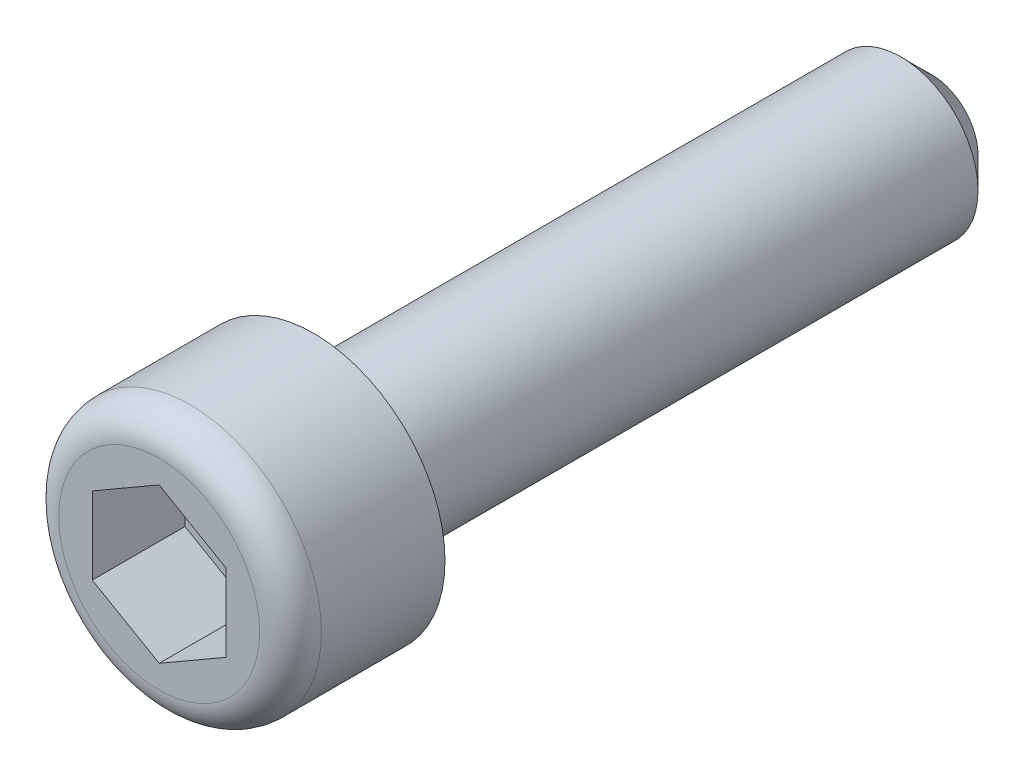
ISO-10303-21;
HEADER;
FILE_DESCRIPTION(('STEP AP214'),'2;1');
FILE_NAME('part.step','',(''),(''),'','','');
FILE_SCHEMA(('AUTOMOTIVE_DESIGN { 1 0 10303 214 1 1 1 1 }'));
ENDSEC;
DATA;
#1=APPLICATION_CONTEXT('core data for automotive mechanical design processes');
#2=APPLICATION_PROTOCOL_DEFINITION('international standard','automotive_design',2000,#1);
#3=PRODUCT_CONTEXT('',#1,'mechanical');
#4=PRODUCT('Part','Part','',(#3));
#5=PRODUCT_RELATED_PRODUCT_CATEGORY('part','',(#4));
#6=PRODUCT_DEFINITION_FORMATION('','',#4);
#7=PRODUCT_DEFINITION_CONTEXT('part definition',#1,'design');
#8=PRODUCT_DEFINITION('design','',#6,#7);
#9=PRODUCT_DEFINITION_SHAPE('','',#8);
#10=(LENGTH_UNIT() NAMED_UNIT(*) SI_UNIT(.MILLI.,.METRE.));
#11=(NAMED_UNIT(*) PLANE_ANGLE_UNIT() SI_UNIT($,.RADIAN.));
#12=(NAMED_UNIT(*) SI_UNIT($,.STERADIAN.) SOLID_ANGLE_UNIT());
#13=UNCERTAINTY_MEASURE_WITH_UNIT(LENGTH_MEASURE(1.E-05),#10,'distance_accuracy_value','');
#14=(GEOMETRIC_REPRESENTATION_CONTEXT(3) GLOBAL_UNCERTAINTY_ASSIGNED_CONTEXT((#13)) GLOBAL_UNIT_ASSIGNED_CONTEXT((#10,
#11,#12)) REPRESENTATION_CONTEXT('',''));
#15=CARTESIAN_POINT('',(0.,0.,0.));
#16=DIRECTION('',(0.,0.,1.));
#17=DIRECTION('',(1.,0.,0.));
#18=AXIS2_PLACEMENT_3D('',#15,#16,#17);
#19=CARTESIAN_POINT('',(0.,0.,0.));
#20=DIRECTION('',(0.,0.,-1.));
#21=DIRECTION('',(-1.,0.,0.));
#22=AXIS2_PLACEMENT_3D('',#19,#20,#21);
#23=PLANE('',#22);
#24=CARTESIAN_POINT('',(0.,0.,0.));
#25=DIRECTION('',(0.,0.,-1.));
#26=DIRECTION('',(-1.,0.,0.));
#27=AXIS2_PLACEMENT_3D('',#24,#25,#26);
#28=CIRCLE('',#27,3.25);
#29=CARTESIAN_POINT('',(-3.25,0.,0.));
#30=VERTEX_POINT('',#29);
#31=EDGE_CURVE('E43',#30,#30,#28,.F.);
#32=ORIENTED_EDGE('',*,*,#31,.T.);
#33=EDGE_LOOP('',(#32));
#34=FACE_BOUND('',#33,.T.);
#35=DIRECTION('',(-0.866025403784439,-0.5,0.));
#36=VECTOR('',#35,1.);
#37=CARTESIAN_POINT('',(0.,2.5,0.));
#38=LINE('',#37,#36);
#39=CARTESIAN_POINT('',(0.,2.5,0.));
#40=VERTEX_POINT('',#39);
#41=CARTESIAN_POINT('',(-2.1650635094611,1.25,0.));
#42=VERTEX_POINT('',#41);
#43=EDGE_CURVE('E124',#40,#42,#38,.T.);
#44=ORIENTED_EDGE('',*,*,#43,.F.);
#45=DIRECTION('',(-0.866025403784439,0.5,0.));
#46=VECTOR('',#45,1.);
#47=CARTESIAN_POINT('',(2.1650635094611,1.25,0.));
#48=LINE('',#47,#46);
#49=CARTESIAN_POINT('',(2.1650635094611,1.25,0.));
#50=VERTEX_POINT('',#49);
#51=EDGE_CURVE('E50',#50,#40,#48,.T.);
#52=ORIENTED_EDGE('',*,*,#51,.F.);
#53=DIRECTION('',(0.,1.,0.));
#54=VECTOR('',#53,1.);
#55=CARTESIAN_POINT('',(2.1650635094611,-1.25,0.));
#56=LINE('',#55,#54);
#57=CARTESIAN_POINT('',(2.1650635094611,-1.25,0.));
#58=VERTEX_POINT('',#57);
#59=EDGE_CURVE('E133',#58,#50,#56,.T.);
#60=ORIENTED_EDGE('',*,*,#59,.F.);
#61=DIRECTION('',(0.866025403784439,0.5,0.));
#62=VECTOR('',#61,1.);
#63=CARTESIAN_POINT('',(0.,-2.5,0.));
#64=LINE('',#63,#62);
#65=CARTESIAN_POINT('',(0.,-2.5,0.));
#66=VERTEX_POINT('',#65);
#67=EDGE_CURVE('E131',#66,#58,#64,.T.);
#68=ORIENTED_EDGE('',*,*,#67,.F.);
#69=DIRECTION('',(0.866025403784439,-0.5,0.));
#70=VECTOR('',#69,1.);
#71=CARTESIAN_POINT('',(-2.1650635094611,-1.25,0.));
#72=LINE('',#71,#70);
#73=CARTESIAN_POINT('',(-2.1650635094611,-1.25,0.));
#74=VERTEX_POINT('',#73);
#75=EDGE_CURVE('E98',#74,#66,#72,.T.);
#76=ORIENTED_EDGE('',*,*,#75,.F.);
#77=DIRECTION('',(0.,-1.,0.));
#78=VECTOR('',#77,1.);
#79=CARTESIAN_POINT('',(-2.1650635094611,1.25,0.));
#80=LINE('',#79,#78);
#81=EDGE_CURVE('E127',#42,#74,#80,.T.);
#82=ORIENTED_EDGE('',*,*,#81,.F.);
#83=EDGE_LOOP('',(#44,#52,#60,#68,#76,#82));
#84=FACE_BOUND('',#83,.T.);
#85=ADVANCED_FACE('F35',(#34,#84),#23,.F.);
#86=CARTESIAN_POINT('',(0.,0.,156.291575098795));
#87=DIRECTION('',(0.,0.,1.));
#88=DIRECTION('',(1.,0.,0.));
#89=AXIS2_PLACEMENT_3D('',#86,#87,#88);
#90=CYLINDRICAL_SURFACE('',#89,4.25);
#91=CARTESIAN_POINT('',(0.,0.,-1.));
#92=DIRECTION('',(0.,0.,-1.));
#93=DIRECTION('',(-1.,0.,0.));
#94=AXIS2_PLACEMENT_3D('',#91,#92,#93);
#95=CIRCLE('',#94,4.25);
#96=CARTESIAN_POINT('',(-4.25,0.,-1.));
#97=VERTEX_POINT('',#96);
#98=EDGE_CURVE('E11',#97,#97,#95,.T.);
#99=ORIENTED_EDGE('',*,*,#98,.T.);
#100=EDGE_LOOP('',(#99));
#101=FACE_BOUND('',#100,.T.);
#102=CARTESIAN_POINT('',(0.,0.,-5.));
#103=DIRECTION('',(0.,0.,1.));
#104=DIRECTION('',(1.,0.,0.));
#105=AXIS2_PLACEMENT_3D('',#102,#103,#104);
#106=CIRCLE('',#105,4.25);
#107=CARTESIAN_POINT('',(4.25,0.,-5.));
#108=VERTEX_POINT('',#107);
#109=EDGE_CURVE('E145',#108,#108,#106,.T.);
#110=ORIENTED_EDGE('',*,*,#109,.T.);
#111=EDGE_LOOP('',(#110));
#112=FACE_BOUND('',#111,.T.);
#113=ADVANCED_FACE('F167',(#101,#112),#90,.T.);
#114=CARTESIAN_POINT('',(0.,4.25,-5.));
#115=DIRECTION('',(0.,0.,1.));
#116=DIRECTION('',(1.,0.,0.));
#117=AXIS2_PLACEMENT_3D('',#114,#115,#116);
#118=PLANE('',#117);
#119=ORIENTED_EDGE('',*,*,#109,.F.);
#120=EDGE_LOOP('',(#119));
#121=FACE_BOUND('',#120,.T.);
#122=CARTESIAN_POINT('',(0.,0.,-5.));
#123=DIRECTION('',(0.,0.,1.));
#124=DIRECTION('',(1.,0.,0.));
#125=AXIS2_PLACEMENT_3D('',#122,#123,#124);
#126=CIRCLE('',#125,2.5);
#127=CARTESIAN_POINT('',(2.5,0.,-5.));
#128=VERTEX_POINT('',#127);
#129=EDGE_CURVE('E137',#128,#128,#126,.T.);
#130=ORIENTED_EDGE('',*,*,#129,.T.);
#131=EDGE_LOOP('',(#130));
#132=FACE_BOUND('',#131,.T.);
#133=ADVANCED_FACE('F172',(#121,#132),#118,.F.);
#134=CARTESIAN_POINT('',(0.,0.,156.291575098795));
#135=DIRECTION('',(0.,0.,1.));
#136=DIRECTION('',(1.,0.,0.));
#137=AXIS2_PLACEMENT_3D('',#134,#135,#136);
#138=CYLINDRICAL_SURFACE('',#137,2.5);
#139=CARTESIAN_POINT('',(0.,0.,-24.));
#140=DIRECTION('',(0.,0.,1.));
#141=DIRECTION('',(1.,0.,0.));
#142=AXIS2_PLACEMENT_3D('',#139,#140,#141);
#143=CIRCLE('',#142,2.5);
#144=CARTESIAN_POINT('',(2.5,0.,-24.));
#145=VERTEX_POINT('',#144);
#146=EDGE_CURVE('E148',#145,#145,#143,.T.);
#147=ORIENTED_EDGE('',*,*,#146,.T.);
#148=EDGE_LOOP('',(#147));
#149=FACE_BOUND('',#148,.T.);
#150=ORIENTED_EDGE('',*,*,#129,.F.);
#151=EDGE_LOOP('',(#150));
#152=FACE_BOUND('',#151,.T.);
#153=ADVANCED_FACE('F178',(#149,#152),#138,.T.);
#154=CARTESIAN_POINT('',(0.,2.5,-25.));
#155=DIRECTION('',(0.,0.,1.));
#156=DIRECTION('',(1.,0.,0.));
#157=AXIS2_PLACEMENT_3D('',#154,#155,#156);
#158=PLANE('',#157);
#159=CARTESIAN_POINT('',(0.,0.,-25.));
#160=DIRECTION('',(0.,0.,1.));
#161=DIRECTION('',(1.,0.,0.));
#162=AXIS2_PLACEMENT_3D('',#159,#160,#161);
#163=CIRCLE('',#162,1.49999999999998);
#164=CARTESIAN_POINT('',(1.49999999999998,0.,-25.));
#165=VERTEX_POINT('',#164);
#166=EDGE_CURVE('E151',#165,#165,#163,.F.);
#167=ORIENTED_EDGE('',*,*,#166,.T.);
#168=EDGE_LOOP('',(#167));
#169=FACE_BOUND('',#168,.T.);
#170=ADVANCED_FACE('F182',(#169),#158,.F.);
#171=CARTESIAN_POINT('',(2.1650635094611,1.25,-3.));
#172=DIRECTION('',(0.5,0.866025403784438,0.));
#173=DIRECTION('',(-0.866025403784439,0.5,0.));
#174=AXIS2_PLACEMENT_3D('',#171,#172,#173);
#175=PLANE('',#174);
#176=ORIENTED_EDGE('',*,*,#51,.T.);
#177=DIRECTION('',(0.,0.,1.));
#178=VECTOR('',#177,1.);
#179=CARTESIAN_POINT('',(0.,2.5,-3.));
#180=LINE('',#179,#178);
#181=CARTESIAN_POINT('',(0.,2.5,-3.));
#182=VERTEX_POINT('',#181);
#183=EDGE_CURVE('E80',#182,#40,#180,.T.);
#184=ORIENTED_EDGE('',*,*,#183,.F.);
#185=DIRECTION('',(-0.866025403784439,0.5,0.));
#186=VECTOR('',#185,1.);
#187=CARTESIAN_POINT('',(2.1650635094611,1.25,-3.));
#188=LINE('',#187,#186);
#189=CARTESIAN_POINT('',(2.1650635094611,1.25,-3.));
#190=VERTEX_POINT('',#189);
#191=EDGE_CURVE('E135',#190,#182,#188,.T.);
#192=ORIENTED_EDGE('',*,*,#191,.F.);
#193=DIRECTION('',(0.,0.,1.));
#194=VECTOR('',#193,1.);
#195=CARTESIAN_POINT('',(2.1650635094611,1.25,-3.));
#196=LINE('',#195,#194);
#197=EDGE_CURVE('E58',#190,#50,#196,.T.);
#198=ORIENTED_EDGE('',*,*,#197,.T.);
#199=EDGE_LOOP('',(#176,#184,#192,#198));
#200=FACE_BOUND('',#199,.T.);
#201=ADVANCED_FACE('F186',(#200),#175,.F.);
#202=CARTESIAN_POINT('',(2.1650635094611,-1.25,-3.));
#203=DIRECTION('',(1.,0.,0.));
#204=DIRECTION('',(0.,0.,-1.));
#205=AXIS2_PLACEMENT_3D('',#202,#203,#204);
#206=PLANE('',#205);
#207=ORIENTED_EDGE('',*,*,#59,.T.);
#208=ORIENTED_EDGE('',*,*,#197,.F.);
#209=DIRECTION('',(0.,1.,0.));
#210=VECTOR('',#209,1.);
#211=CARTESIAN_POINT('',(2.1650635094611,-1.25,-3.));
#212=LINE('',#211,#210);
#213=CARTESIAN_POINT('',(2.1650635094611,-1.25,-3.));
#214=VERTEX_POINT('',#213);
#215=EDGE_CURVE('E110',#214,#190,#212,.T.);
#216=ORIENTED_EDGE('',*,*,#215,.F.);
#217=DIRECTION('',(0.,0.,1.));
#218=VECTOR('',#217,1.);
#219=CARTESIAN_POINT('',(2.1650635094611,-1.25,-3.));
#220=LINE('',#219,#218);
#221=EDGE_CURVE('E102',#214,#58,#220,.T.);
#222=ORIENTED_EDGE('',*,*,#221,.T.);
#223=EDGE_LOOP('',(#207,#208,#216,#222));
#224=FACE_BOUND('',#223,.T.);
#225=ADVANCED_FACE('F190',(#224),#206,.F.);
#226=CARTESIAN_POINT('',(0.,-2.5,-3.));
#227=DIRECTION('',(0.5,-0.866025403784439,0.));
#228=DIRECTION('',(0.866025403784439,0.5,0.));
#229=AXIS2_PLACEMENT_3D('',#226,#227,#228);
#230=PLANE('',#229);
#231=ORIENTED_EDGE('',*,*,#67,.T.);
#232=ORIENTED_EDGE('',*,*,#221,.F.);
#233=DIRECTION('',(0.866025403784439,0.5,0.));
#234=VECTOR('',#233,1.);
#235=CARTESIAN_POINT('',(0.,-2.5,-3.));
#236=LINE('',#235,#234);
#237=CARTESIAN_POINT('',(0.,-2.5,-3.));
#238=VERTEX_POINT('',#237);
#239=EDGE_CURVE('E106',#238,#214,#236,.T.);
#240=ORIENTED_EDGE('',*,*,#239,.F.);
#241=DIRECTION('',(0.,0.,1.));
#242=VECTOR('',#241,1.);
#243=CARTESIAN_POINT('',(0.,-2.5,-3.));
#244=LINE('',#243,#242);
#245=EDGE_CURVE('E91',#238,#66,#244,.T.);
#246=ORIENTED_EDGE('',*,*,#245,.T.);
#247=EDGE_LOOP('',(#231,#232,#240,#246));
#248=FACE_BOUND('',#247,.T.);
#249=ADVANCED_FACE('F107',(#248),#230,.F.);
#250=CARTESIAN_POINT('',(-2.1650635094611,-1.25,-3.));
#251=DIRECTION('',(-0.5,-0.866025403784438,0.));
#252=DIRECTION('',(0.866025403784439,-0.5,0.));
#253=AXIS2_PLACEMENT_3D('',#250,#251,#252);
#254=PLANE('',#253);
#255=ORIENTED_EDGE('',*,*,#75,.T.);
#256=ORIENTED_EDGE('',*,*,#245,.F.);
#257=DIRECTION('',(0.866025403784439,-0.5,0.));
#258=VECTOR('',#257,1.);
#259=CARTESIAN_POINT('',(-2.1650635094611,-1.25,-3.));
#260=LINE('',#259,#258);
#261=CARTESIAN_POINT('',(-2.1650635094611,-1.25,-3.));
#262=VERTEX_POINT('',#261);
#263=EDGE_CURVE('E95',#262,#238,#260,.T.);
#264=ORIENTED_EDGE('',*,*,#263,.F.);
#265=DIRECTION('',(0.,0.,1.));
#266=VECTOR('',#265,1.);
#267=CARTESIAN_POINT('',(-2.1650635094611,-1.25,-3.));
#268=LINE('',#267,#266);
#269=EDGE_CURVE('E103',#262,#74,#268,.T.);
#270=ORIENTED_EDGE('',*,*,#269,.T.);
#271=EDGE_LOOP('',(#255,#256,#264,#270));
#272=FACE_BOUND('',#271,.T.);
#273=ADVANCED_FACE('F93',(#272),#254,.F.);
#274=CARTESIAN_POINT('',(-2.1650635094611,1.25,-3.));
#275=DIRECTION('',(-1.,0.,0.));
#276=DIRECTION('',(0.,-1.,0.));
#277=AXIS2_PLACEMENT_3D('',#274,#275,#276);
#278=PLANE('',#277);
#279=ORIENTED_EDGE('',*,*,#81,.T.);
#280=ORIENTED_EDGE('',*,*,#269,.F.);
#281=DIRECTION('',(0.,-1.,0.));
#282=VECTOR('',#281,1.);
#283=CARTESIAN_POINT('',(-2.1650635094611,1.25,-3.));
#284=LINE('',#283,#282);
#285=CARTESIAN_POINT('',(-2.1650635094611,1.25,-3.));
#286=VERTEX_POINT('',#285);
#287=EDGE_CURVE('E116',#286,#262,#284,.T.);
#288=ORIENTED_EDGE('',*,*,#287,.F.);
#289=DIRECTION('',(0.,0.,1.));
#290=VECTOR('',#289,1.);
#291=CARTESIAN_POINT('',(-2.1650635094611,1.25,-3.));
#292=LINE('',#291,#290);
#293=EDGE_CURVE('E140',#286,#42,#292,.T.);
#294=ORIENTED_EDGE('',*,*,#293,.T.);
#295=EDGE_LOOP('',(#279,#280,#288,#294));
#296=FACE_BOUND('',#295,.T.);
#297=ADVANCED_FACE('F194',(#296),#278,.F.);
#298=CARTESIAN_POINT('',(0.,2.5,-3.));
#299=DIRECTION('',(-0.5,0.866025403784439,0.));
#300=DIRECTION('',(-0.866025403784439,-0.5,0.));
#301=AXIS2_PLACEMENT_3D('',#298,#299,#300);
#302=PLANE('',#301);
#303=ORIENTED_EDGE('',*,*,#43,.T.);
#304=ORIENTED_EDGE('',*,*,#293,.F.);
#305=DIRECTION('',(-0.866025403784439,-0.5,0.));
#306=VECTOR('',#305,1.);
#307=CARTESIAN_POINT('',(0.,2.5,-3.));
#308=LINE('',#307,#306);
#309=EDGE_CURVE('E118',#182,#286,#308,.T.);
#310=ORIENTED_EDGE('',*,*,#309,.F.);
#311=ORIENTED_EDGE('',*,*,#183,.T.);
#312=EDGE_LOOP('',(#303,#304,#310,#311));
#313=FACE_BOUND('',#312,.T.);
#314=ADVANCED_FACE('F191',(#313),#302,.F.);
#315=CARTESIAN_POINT('',(0.,0.,-3.));
#316=DIRECTION('',(0.,0.,1.));
#317=DIRECTION('',(1.,0.,0.));
#318=AXIS2_PLACEMENT_3D('',#315,#316,#317);
#319=PLANE('',#318);
#320=ORIENTED_EDGE('',*,*,#191,.T.);
#321=ORIENTED_EDGE('',*,*,#309,.T.);
#322=ORIENTED_EDGE('',*,*,#287,.T.);
#323=ORIENTED_EDGE('',*,*,#263,.T.);
#324=ORIENTED_EDGE('',*,*,#239,.T.);
#325=ORIENTED_EDGE('',*,*,#215,.T.);
#326=EDGE_LOOP('',(#320,#321,#322,#323,#324,#325));
#327=FACE_BOUND('',#326,.T.);
#328=ADVANCED_FACE('F113',(#327),#319,.T.);
#329=CARTESIAN_POINT('',(0.,0.,-24.));
#330=DIRECTION('',(0.,0.,1.));
#331=DIRECTION('',(1.,0.,0.));
#332=AXIS2_PLACEMENT_3D('',#329,#330,#331);
#333=CONICAL_SURFACE('',#332,2.5,0.785398163397454);
#334=ORIENTED_EDGE('',*,*,#166,.F.);
#335=EDGE_LOOP('',(#334));
#336=FACE_BOUND('',#335,.T.);
#337=ORIENTED_EDGE('',*,*,#146,.F.);
#338=EDGE_LOOP('',(#337));
#339=FACE_BOUND('',#338,.T.);
#340=ADVANCED_FACE('F159',(#336,#339),#333,.T.);
#341=CARTESIAN_POINT('',(0.,0.,-1.));
#342=DIRECTION('',(0.,0.,-1.));
#343=DIRECTION('',(-1.,0.,0.));
#344=AXIS2_PLACEMENT_3D('',#341,#342,#343);
#345=TOROIDAL_SURFACE('',#344,3.25,1.);
#346=ORIENTED_EDGE('',*,*,#98,.F.);
#347=EDGE_LOOP('',(#346));
#348=FACE_BOUND('',#347,.T.);
#349=ORIENTED_EDGE('',*,*,#31,.F.);
#350=EDGE_LOOP('',(#349));
#351=FACE_BOUND('',#350,.T.);
#352=ADVANCED_FACE('F37',(#348,#351),#345,.T.);
#353=CLOSED_SHELL('',(#85,#113,#133,#153,#170,#201,#225,#249,#273,#297,#314,#328,#340,#352));
#354=MANIFOLD_SOLID_BREP('B2',#353);
#355=ADVANCED_BREP_SHAPE_REPRESENTATION('',(#18,#354),#14);
#356=SHAPE_DEFINITION_REPRESENTATION(#9,#355);
ENDSEC;
END-ISO-10303-21;
